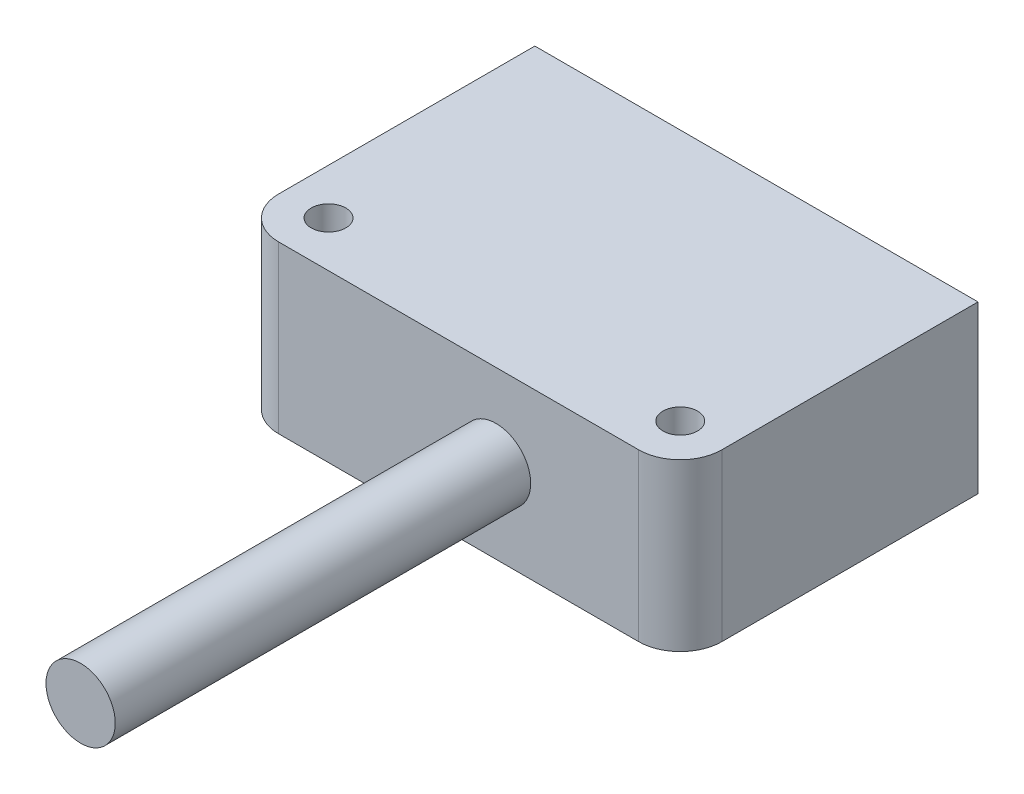
ISO-10303-21;
HEADER;
FILE_DESCRIPTION(('STEP AP214'),'2;1');
FILE_NAME('part.step','',(''),(''),'','','');
FILE_SCHEMA(('AUTOMOTIVE_DESIGN { 1 0 10303 214 1 1 1 1 }'));
ENDSEC;
DATA;
#1=APPLICATION_CONTEXT('core data for automotive mechanical design processes');
#2=APPLICATION_PROTOCOL_DEFINITION('international standard','automotive_design',2000,#1);
#3=PRODUCT_CONTEXT('',#1,'mechanical');
#4=PRODUCT('Part','Part','',(#3));
#5=PRODUCT_RELATED_PRODUCT_CATEGORY('part','',(#4));
#6=PRODUCT_DEFINITION_FORMATION('','',#4);
#7=PRODUCT_DEFINITION_CONTEXT('part definition',#1,'design');
#8=PRODUCT_DEFINITION('design','',#6,#7);
#9=PRODUCT_DEFINITION_SHAPE('','',#8);
#10=(LENGTH_UNIT() NAMED_UNIT(*) SI_UNIT(.MILLI.,.METRE.));
#11=(NAMED_UNIT(*) PLANE_ANGLE_UNIT() SI_UNIT($,.RADIAN.));
#12=(NAMED_UNIT(*) SI_UNIT($,.STERADIAN.) SOLID_ANGLE_UNIT());
#13=UNCERTAINTY_MEASURE_WITH_UNIT(LENGTH_MEASURE(1.E-05),#10,'distance_accuracy_value','');
#14=(GEOMETRIC_REPRESENTATION_CONTEXT(3) GLOBAL_UNCERTAINTY_ASSIGNED_CONTEXT((#13)) GLOBAL_UNIT_ASSIGNED_CONTEXT((#10,
#11,#12)) REPRESENTATION_CONTEXT('',''));
#15=CARTESIAN_POINT('',(0.,0.,0.));
#16=DIRECTION('',(0.,0.,1.));
#17=DIRECTION('',(1.,0.,0.));
#18=AXIS2_PLACEMENT_3D('',#15,#16,#17);
#19=CARTESIAN_POINT('',(16.,12.,10.75));
#20=DIRECTION('',(-1.,0.,0.));
#21=DIRECTION('',(0.,0.,1.));
#22=AXIS2_PLACEMENT_3D('',#19,#20,#21);
#23=PLANE('',#22);
#24=DIRECTION('',(0.,0.,-1.));
#25=VECTOR('',#24,1.);
#26=CARTESIAN_POINT('',(16.,12.,10.75));
#27=LINE('',#26,#25);
#28=CARTESIAN_POINT('',(16.,12.,7.75));
#29=VERTEX_POINT('',#28);
#30=CARTESIAN_POINT('',(16.,12.,-10.75));
#31=VERTEX_POINT('',#30);
#32=EDGE_CURVE('E107',#29,#31,#27,.T.);
#33=ORIENTED_EDGE('',*,*,#32,.F.);
#34=DIRECTION('',(0.,-1.,0.));
#35=VECTOR('',#34,1.);
#36=CARTESIAN_POINT('',(16.,12.,7.75));
#37=LINE('',#36,#35);
#38=CARTESIAN_POINT('',(16.,0.,7.75));
#39=VERTEX_POINT('',#38);
#40=EDGE_CURVE('E134',#29,#39,#37,.T.);
#41=ORIENTED_EDGE('',*,*,#40,.T.);
#42=DIRECTION('',(0.,0.,-1.));
#43=VECTOR('',#42,1.);
#44=CARTESIAN_POINT('',(16.,0.,10.75));
#45=LINE('',#44,#43);
#46=CARTESIAN_POINT('',(16.,0.,-10.75));
#47=VERTEX_POINT('',#46);
#48=EDGE_CURVE('E131',#39,#47,#45,.T.);
#49=ORIENTED_EDGE('',*,*,#48,.T.);
#50=DIRECTION('',(0.,-1.,0.));
#51=VECTOR('',#50,1.);
#52=CARTESIAN_POINT('',(16.,12.,-10.75));
#53=LINE('',#52,#51);
#54=EDGE_CURVE('E124',#31,#47,#53,.T.);
#55=ORIENTED_EDGE('',*,*,#54,.F.);
#56=EDGE_LOOP('',(#33,#41,#49,#55));
#57=FACE_BOUND('',#56,.T.);
#58=ADVANCED_FACE('F51',(#57),#23,.F.);
#59=CARTESIAN_POINT('',(-16.,12.,-10.75));
#60=DIRECTION('',(0.,0.,1.));
#61=DIRECTION('',(1.,0.,0.));
#62=AXIS2_PLACEMENT_3D('',#59,#60,#61);
#63=PLANE('',#62);
#64=DIRECTION('',(-1.,0.,0.));
#65=VECTOR('',#64,1.);
#66=CARTESIAN_POINT('',(-16.,0.,-10.75));
#67=LINE('',#66,#65);
#68=CARTESIAN_POINT('',(-16.,0.,-10.75));
#69=VERTEX_POINT('',#68);
#70=EDGE_CURVE('E173',#47,#69,#67,.T.);
#71=ORIENTED_EDGE('',*,*,#70,.T.);
#72=DIRECTION('',(0.,-1.,0.));
#73=VECTOR('',#72,1.);
#74=CARTESIAN_POINT('',(-16.,12.,-10.75));
#75=LINE('',#74,#73);
#76=CARTESIAN_POINT('',(-16.,12.,-10.75));
#77=VERTEX_POINT('',#76);
#78=EDGE_CURVE('E126',#77,#69,#75,.T.);
#79=ORIENTED_EDGE('',*,*,#78,.F.);
#80=DIRECTION('',(-1.,0.,0.));
#81=VECTOR('',#80,1.);
#82=CARTESIAN_POINT('',(-16.,12.,-10.75));
#83=LINE('',#82,#81);
#84=EDGE_CURVE('E110',#31,#77,#83,.T.);
#85=ORIENTED_EDGE('',*,*,#84,.F.);
#86=ORIENTED_EDGE('',*,*,#54,.T.);
#87=EDGE_LOOP('',(#71,#79,#85,#86));
#88=FACE_BOUND('',#87,.T.);
#89=ADVANCED_FACE('F123',(#88),#63,.F.);
#90=CARTESIAN_POINT('',(-16.,12.,10.75));
#91=DIRECTION('',(1.,0.,0.));
#92=DIRECTION('',(0.,0.,-1.));
#93=AXIS2_PLACEMENT_3D('',#90,#91,#92);
#94=PLANE('',#93);
#95=DIRECTION('',(0.,0.,1.));
#96=VECTOR('',#95,1.);
#97=CARTESIAN_POINT('',(-16.,0.,10.75));
#98=LINE('',#97,#96);
#99=CARTESIAN_POINT('',(-16.,0.,7.75));
#100=VERTEX_POINT('',#99);
#101=EDGE_CURVE('E170',#69,#100,#98,.T.);
#102=ORIENTED_EDGE('',*,*,#101,.T.);
#103=DIRECTION('',(0.,-1.,0.));
#104=VECTOR('',#103,1.);
#105=CARTESIAN_POINT('',(-16.,12.,7.75));
#106=LINE('',#105,#104);
#107=CARTESIAN_POINT('',(-16.,12.,7.75));
#108=VERTEX_POINT('',#107);
#109=EDGE_CURVE('E60',#100,#108,#106,.F.);
#110=ORIENTED_EDGE('',*,*,#109,.T.);
#111=DIRECTION('',(0.,0.,1.));
#112=VECTOR('',#111,1.);
#113=CARTESIAN_POINT('',(-16.,12.,10.75));
#114=LINE('',#113,#112);
#115=EDGE_CURVE('E128',#77,#108,#114,.T.);
#116=ORIENTED_EDGE('',*,*,#115,.F.);
#117=ORIENTED_EDGE('',*,*,#78,.T.);
#118=EDGE_LOOP('',(#102,#110,#116,#117));
#119=FACE_BOUND('',#118,.T.);
#120=ADVANCED_FACE('F171',(#119),#94,.F.);
#121=CARTESIAN_POINT('',(-16.,12.,10.75));
#122=DIRECTION('',(0.,0.,-1.));
#123=DIRECTION('',(-1.,0.,0.));
#124=AXIS2_PLACEMENT_3D('',#121,#122,#123);
#125=PLANE('',#124);
#126=CARTESIAN_POINT('',(2.7,6.,10.75));
#127=DIRECTION('',(0.,0.,-1.));
#128=DIRECTION('',(-1.,0.,0.));
#129=AXIS2_PLACEMENT_3D('',#126,#127,#128);
#130=CIRCLE('',#129,2.5);
#131=CARTESIAN_POINT('',(0.200000000000003,6.,10.75));
#132=VERTEX_POINT('',#131);
#133=EDGE_CURVE('E11',#132,#132,#130,.F.);
#134=ORIENTED_EDGE('',*,*,#133,.F.);
#135=EDGE_LOOP('',(#134));
#136=FACE_BOUND('',#135,.T.);
#137=DIRECTION('',(1.,0.,0.));
#138=VECTOR('',#137,1.);
#139=CARTESIAN_POINT('',(-16.,0.,10.75));
#140=LINE('',#139,#138);
#141=CARTESIAN_POINT('',(-13.,0.,10.75));
#142=VERTEX_POINT('',#141);
#143=CARTESIAN_POINT('',(13.,0.,10.75));
#144=VERTEX_POINT('',#143);
#145=EDGE_CURVE('E119',#142,#144,#140,.T.);
#146=ORIENTED_EDGE('',*,*,#145,.T.);
#147=DIRECTION('',(0.,-1.,0.));
#148=VECTOR('',#147,1.);
#149=CARTESIAN_POINT('',(13.,12.,10.75));
#150=LINE('',#149,#148);
#151=CARTESIAN_POINT('',(13.,12.,10.75));
#152=VERTEX_POINT('',#151);
#153=EDGE_CURVE('E74',#144,#152,#150,.F.);
#154=ORIENTED_EDGE('',*,*,#153,.T.);
#155=DIRECTION('',(1.,0.,0.));
#156=VECTOR('',#155,1.);
#157=CARTESIAN_POINT('',(-16.,12.,10.75));
#158=LINE('',#157,#156);
#159=CARTESIAN_POINT('',(-13.,12.,10.75));
#160=VERTEX_POINT('',#159);
#161=EDGE_CURVE('E140',#160,#152,#158,.T.);
#162=ORIENTED_EDGE('',*,*,#161,.F.);
#163=DIRECTION('',(0.,-1.,0.));
#164=VECTOR('',#163,1.);
#165=CARTESIAN_POINT('',(-13.,12.,10.75));
#166=LINE('',#165,#164);
#167=EDGE_CURVE('E149',#160,#142,#166,.T.);
#168=ORIENTED_EDGE('',*,*,#167,.T.);
#169=EDGE_LOOP('',(#146,#154,#162,#168));
#170=FACE_BOUND('',#169,.T.);
#171=ADVANCED_FACE('F163',(#136,#170),#125,.F.);
#172=CARTESIAN_POINT('',(0.,12.,0.));
#173=DIRECTION('',(0.,-1.,0.));
#174=DIRECTION('',(0.,0.,-1.));
#175=AXIS2_PLACEMENT_3D('',#172,#173,#174);
#176=PLANE('',#175);
#177=CARTESIAN_POINT('',(-12.7,12.,7.44999999999999));
#178=DIRECTION('',(0.,1.,0.));
#179=DIRECTION('',(0.,0.,1.));
#180=AXIS2_PLACEMENT_3D('',#177,#178,#179);
#181=CIRCLE('',#180,1.24999999999999);
#182=CARTESIAN_POINT('',(-12.7,12.,8.69999999999998));
#183=VERTEX_POINT('',#182);
#184=EDGE_CURVE('E195',#183,#183,#181,.T.);
#185=ORIENTED_EDGE('',*,*,#184,.F.);
#186=EDGE_LOOP('',(#185));
#187=FACE_BOUND('',#186,.T.);
#188=CARTESIAN_POINT('',(12.7,12.,7.44999999999999));
#189=DIRECTION('',(0.,1.,0.));
#190=DIRECTION('',(0.,0.,1.));
#191=AXIS2_PLACEMENT_3D('',#188,#189,#190);
#192=CIRCLE('',#191,1.24999999999999);
#193=CARTESIAN_POINT('',(12.7,12.,8.69999999999998));
#194=VERTEX_POINT('',#193);
#195=EDGE_CURVE('E187',#194,#194,#192,.T.);
#196=ORIENTED_EDGE('',*,*,#195,.F.);
#197=EDGE_LOOP('',(#196));
#198=FACE_BOUND('',#197,.T.);
#199=ORIENTED_EDGE('',*,*,#161,.T.);
#200=CARTESIAN_POINT('',(13.,12.,7.75));
#201=DIRECTION('',(0.,-1.,0.));
#202=DIRECTION('',(0.,0.,-1.));
#203=AXIS2_PLACEMENT_3D('',#200,#201,#202);
#204=CIRCLE('',#203,3.);
#205=EDGE_CURVE('E113',#152,#29,#204,.F.);
#206=ORIENTED_EDGE('',*,*,#205,.T.);
#207=ORIENTED_EDGE('',*,*,#32,.T.);
#208=ORIENTED_EDGE('',*,*,#84,.T.);
#209=ORIENTED_EDGE('',*,*,#115,.T.);
#210=CARTESIAN_POINT('',(-13.,12.,7.75));
#211=DIRECTION('',(0.,-1.,0.));
#212=DIRECTION('',(0.,0.,-1.));
#213=AXIS2_PLACEMENT_3D('',#210,#211,#212);
#214=CIRCLE('',#213,3.);
#215=EDGE_CURVE('E155',#108,#160,#214,.F.);
#216=ORIENTED_EDGE('',*,*,#215,.T.);
#217=EDGE_LOOP('',(#199,#206,#207,#208,#209,#216));
#218=FACE_BOUND('',#217,.T.);
#219=ADVANCED_FACE('F109',(#187,#198,#218),#176,.F.);
#220=CARTESIAN_POINT('',(0.,0.,0.));
#221=DIRECTION('',(0.,-1.,0.));
#222=DIRECTION('',(0.,0.,-1.));
#223=AXIS2_PLACEMENT_3D('',#220,#221,#222);
#224=PLANE('',#223);
#225=CARTESIAN_POINT('',(-12.7,0.,7.44999999999999));
#226=DIRECTION('',(0.,1.,0.));
#227=DIRECTION('',(0.,0.,1.));
#228=AXIS2_PLACEMENT_3D('',#225,#226,#227);
#229=CIRCLE('',#228,1.25);
#230=CARTESIAN_POINT('',(-12.7,0.,8.69999999999999));
#231=VERTEX_POINT('',#230);
#232=EDGE_CURVE('E191',#231,#231,#229,.T.);
#233=ORIENTED_EDGE('',*,*,#232,.T.);
#234=EDGE_LOOP('',(#233));
#235=FACE_BOUND('',#234,.T.);
#236=CARTESIAN_POINT('',(12.7,0.,7.44999999999999));
#237=DIRECTION('',(0.,1.,0.));
#238=DIRECTION('',(0.,0.,1.));
#239=AXIS2_PLACEMENT_3D('',#236,#237,#238);
#240=CIRCLE('',#239,1.25);
#241=CARTESIAN_POINT('',(12.7,0.,8.69999999999999));
#242=VERTEX_POINT('',#241);
#243=EDGE_CURVE('E180',#242,#242,#240,.T.);
#244=ORIENTED_EDGE('',*,*,#243,.T.);
#245=EDGE_LOOP('',(#244));
#246=FACE_BOUND('',#245,.T.);
#247=ORIENTED_EDGE('',*,*,#48,.F.);
#248=CARTESIAN_POINT('',(13.,0.,7.75));
#249=DIRECTION('',(0.,-1.,0.));
#250=DIRECTION('',(0.,0.,-1.));
#251=AXIS2_PLACEMENT_3D('',#248,#249,#250);
#252=CIRCLE('',#251,3.);
#253=EDGE_CURVE('E146',#39,#144,#252,.T.);
#254=ORIENTED_EDGE('',*,*,#253,.T.);
#255=ORIENTED_EDGE('',*,*,#145,.F.);
#256=CARTESIAN_POINT('',(-13.,0.,7.75));
#257=DIRECTION('',(0.,-1.,0.));
#258=DIRECTION('',(0.,0.,-1.));
#259=AXIS2_PLACEMENT_3D('',#256,#257,#258);
#260=CIRCLE('',#259,3.);
#261=EDGE_CURVE('E138',#142,#100,#260,.T.);
#262=ORIENTED_EDGE('',*,*,#261,.T.);
#263=ORIENTED_EDGE('',*,*,#101,.F.);
#264=ORIENTED_EDGE('',*,*,#70,.F.);
#265=EDGE_LOOP('',(#247,#254,#255,#262,#263,#264));
#266=FACE_BOUND('',#265,.T.);
#267=ADVANCED_FACE('F169',(#235,#246,#266),#224,.T.);
#268=CARTESIAN_POINT('',(12.7,12.,7.44999999999999));
#269=DIRECTION('',(0.,1.,0.));
#270=DIRECTION('',(0.,0.,1.));
#271=AXIS2_PLACEMENT_3D('',#268,#269,#270);
#272=CYLINDRICAL_SURFACE('',#271,1.24999999999999);
#273=ORIENTED_EDGE('',*,*,#243,.F.);
#274=EDGE_LOOP('',(#273));
#275=FACE_BOUND('',#274,.T.);
#276=ORIENTED_EDGE('',*,*,#195,.T.);
#277=EDGE_LOOP('',(#276));
#278=FACE_BOUND('',#277,.T.);
#279=ADVANCED_FACE('F239',(#275,#278),#272,.F.);
#280=CARTESIAN_POINT('',(-12.7,12.,7.44999999999999));
#281=DIRECTION('',(0.,1.,0.));
#282=DIRECTION('',(0.,0.,1.));
#283=AXIS2_PLACEMENT_3D('',#280,#281,#282);
#284=CYLINDRICAL_SURFACE('',#283,1.24999999999999);
#285=ORIENTED_EDGE('',*,*,#232,.F.);
#286=EDGE_LOOP('',(#285));
#287=FACE_BOUND('',#286,.T.);
#288=ORIENTED_EDGE('',*,*,#184,.T.);
#289=EDGE_LOOP('',(#288));
#290=FACE_BOUND('',#289,.T.);
#291=ADVANCED_FACE('F233',(#287,#290),#284,.F.);
#292=CARTESIAN_POINT('',(13.,12.,7.75));
#293=DIRECTION('',(0.,-1.,0.));
#294=DIRECTION('',(0.,0.,-1.));
#295=AXIS2_PLACEMENT_3D('',#292,#293,#294);
#296=CYLINDRICAL_SURFACE('',#295,3.);
#297=ORIENTED_EDGE('',*,*,#205,.F.);
#298=ORIENTED_EDGE('',*,*,#153,.F.);
#299=ORIENTED_EDGE('',*,*,#253,.F.);
#300=ORIENTED_EDGE('',*,*,#40,.F.);
#301=EDGE_LOOP('',(#297,#298,#299,#300));
#302=FACE_BOUND('',#301,.T.);
#303=ADVANCED_FACE('F231',(#302),#296,.T.);
#304=CARTESIAN_POINT('',(-13.,12.,7.75));
#305=DIRECTION('',(0.,-1.,0.));
#306=DIRECTION('',(0.,0.,-1.));
#307=AXIS2_PLACEMENT_3D('',#304,#305,#306);
#308=CYLINDRICAL_SURFACE('',#307,3.);
#309=ORIENTED_EDGE('',*,*,#215,.F.);
#310=ORIENTED_EDGE('',*,*,#109,.F.);
#311=ORIENTED_EDGE('',*,*,#261,.F.);
#312=ORIENTED_EDGE('',*,*,#167,.F.);
#313=EDGE_LOOP('',(#309,#310,#311,#312));
#314=FACE_BOUND('',#313,.T.);
#315=ADVANCED_FACE('F53',(#314),#308,.T.);
#316=CARTESIAN_POINT('',(2.7,6.,40.75));
#317=DIRECTION('',(0.,0.,-1.));
#318=DIRECTION('',(-1.,0.,0.));
#319=AXIS2_PLACEMENT_3D('',#316,#317,#318);
#320=CYLINDRICAL_SURFACE('',#319,2.5);
#321=CARTESIAN_POINT('',(2.7,6.,40.75));
#322=DIRECTION('',(0.,0.,1.));
#323=DIRECTION('',(1.,0.,0.));
#324=AXIS2_PLACEMENT_3D('',#321,#322,#323);
#325=CIRCLE('',#324,2.5);
#326=CARTESIAN_POINT('',(5.2,6.,40.75));
#327=VERTEX_POINT('',#326);
#328=EDGE_CURVE('E199',#327,#327,#325,.T.);
#329=ORIENTED_EDGE('',*,*,#328,.F.);
#330=EDGE_LOOP('',(#329));
#331=FACE_BOUND('',#330,.T.);
#332=ORIENTED_EDGE('',*,*,#133,.T.);
#333=EDGE_LOOP('',(#332));
#334=FACE_BOUND('',#333,.T.);
#335=ADVANCED_FACE('F206',(#331,#334),#320,.T.);
#336=CARTESIAN_POINT('',(2.7,6.,40.75));
#337=DIRECTION('',(0.,0.,1.));
#338=DIRECTION('',(1.,0.,0.));
#339=AXIS2_PLACEMENT_3D('',#336,#337,#338);
#340=PLANE('',#339);
#341=ORIENTED_EDGE('',*,*,#328,.T.);
#342=EDGE_LOOP('',(#341));
#343=FACE_BOUND('',#342,.T.);
#344=ADVANCED_FACE('F204',(#343),#340,.T.);
#345=CLOSED_SHELL('',(#58,#89,#120,#171,#219,#267,#279,#291,#303,#315,#335,#344));
#346=MANIFOLD_SOLID_BREP('B2',#345);
#347=ADVANCED_BREP_SHAPE_REPRESENTATION('',(#18,#346),#14);
#348=SHAPE_DEFINITION_REPRESENTATION(#9,#347);
ENDSEC;
END-ISO-10303-21;
